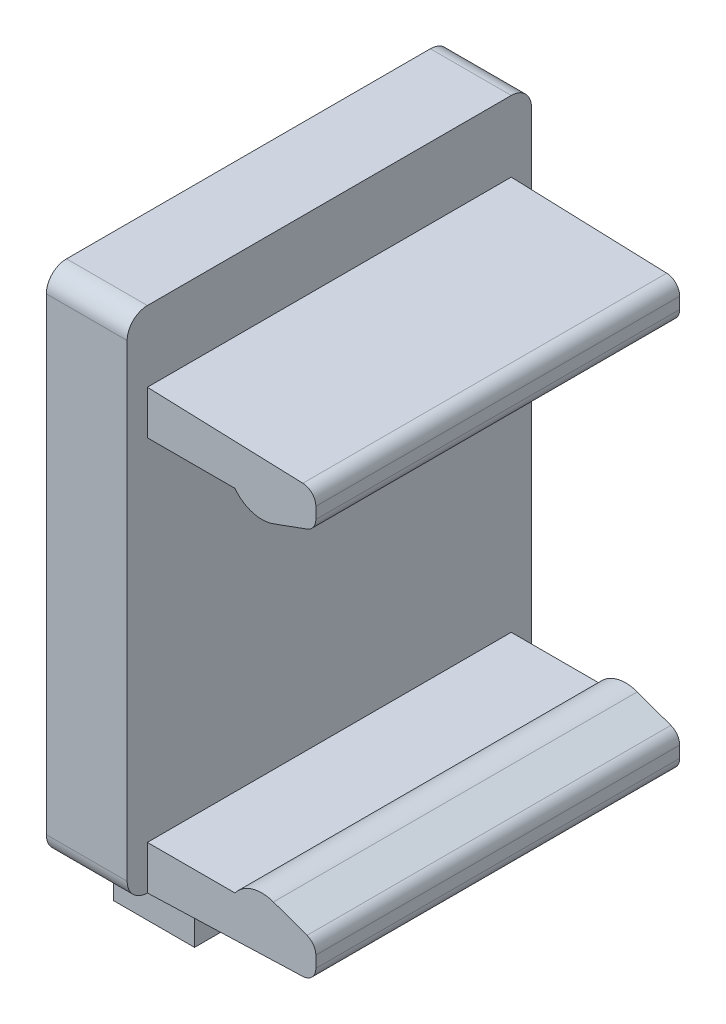
ISO-10303-21;
HEADER;
FILE_DESCRIPTION(('STEP AP214'),'2;1');
FILE_NAME('part.step','',(''),(''),'','','');
FILE_SCHEMA(('AUTOMOTIVE_DESIGN { 1 0 10303 214 1 1 1 1 }'));
ENDSEC;
DATA;
#1=APPLICATION_CONTEXT('core data for automotive mechanical design processes');
#2=APPLICATION_PROTOCOL_DEFINITION('international standard','automotive_design',2000,#1);
#3=PRODUCT_CONTEXT('',#1,'mechanical');
#4=PRODUCT('Part','Part','',(#3));
#5=PRODUCT_RELATED_PRODUCT_CATEGORY('part','',(#4));
#6=PRODUCT_DEFINITION_FORMATION('','',#4);
#7=PRODUCT_DEFINITION_CONTEXT('part definition',#1,'design');
#8=PRODUCT_DEFINITION('design','',#6,#7);
#9=PRODUCT_DEFINITION_SHAPE('','',#8);
#10=(LENGTH_UNIT() NAMED_UNIT(*) SI_UNIT(.MILLI.,.METRE.));
#11=(NAMED_UNIT(*) PLANE_ANGLE_UNIT() SI_UNIT($,.RADIAN.));
#12=(NAMED_UNIT(*) SI_UNIT($,.STERADIAN.) SOLID_ANGLE_UNIT());
#13=UNCERTAINTY_MEASURE_WITH_UNIT(LENGTH_MEASURE(1.E-05),#10,'distance_accuracy_value','');
#14=(GEOMETRIC_REPRESENTATION_CONTEXT(3) GLOBAL_UNCERTAINTY_ASSIGNED_CONTEXT((#13)) GLOBAL_UNIT_ASSIGNED_CONTEXT((#10,
#11,#12)) REPRESENTATION_CONTEXT('',''));
#15=CARTESIAN_POINT('',(0.,0.,0.));
#16=DIRECTION('',(0.,0.,1.));
#17=DIRECTION('',(1.,0.,0.));
#18=AXIS2_PLACEMENT_3D('',#15,#16,#17);
#19=CARTESIAN_POINT('',(-11.238795,-11.9225691911831,3.47573182009755));
#20=DIRECTION('',(0.,0.,-1.));
#21=DIRECTION('',(-1.,0.,0.));
#22=AXIS2_PLACEMENT_3D('',#19,#20,#21);
#23=CYLINDRICAL_SURFACE('',#22,0.2);
#24=DIRECTION('',(0.,0.,1.));
#25=VECTOR('',#24,1.);
#26=CARTESIAN_POINT('',(-11.1703909713349,-12.1105077153403,4.05));
#27=LINE('',#26,#25);
#28=CARTESIAN_POINT('',(-11.1703909713349,-12.1105077153403,0.0999999999999994));
#29=VERTEX_POINT('',#28);
#30=CARTESIAN_POINT('',(-11.1703909713349,-12.1105077153403,5.5));
#31=VERTEX_POINT('',#30);
#32=EDGE_CURVE('E301',#29,#31,#27,.T.);
#33=ORIENTED_EDGE('',*,*,#32,.F.);
#34=CARTESIAN_POINT('',(-11.238795,-11.9225691911831,0.0999999999999994));
#35=DIRECTION('',(0.,0.,-1.));
#36=DIRECTION('',(-1.,0.,0.));
#37=AXIS2_PLACEMENT_3D('',#34,#35,#36);
#38=CIRCLE('',#37,0.2);
#39=CARTESIAN_POINT('',(-11.038795,-11.9225691911831,0.0999999999999995));
#40=VERTEX_POINT('',#39);
#41=EDGE_CURVE('E193',#29,#40,#38,.F.);
#42=ORIENTED_EDGE('',*,*,#41,.T.);
#43=DIRECTION('',(0.,0.,-1.));
#44=VECTOR('',#43,1.);
#45=CARTESIAN_POINT('',(-11.038795,-11.9225691911831,4.8));
#46=LINE('',#45,#44);
#47=CARTESIAN_POINT('',(-11.038795,-11.9225691911831,5.5));
#48=VERTEX_POINT('',#47);
#49=EDGE_CURVE('E195',#48,#40,#46,.T.);
#50=ORIENTED_EDGE('',*,*,#49,.F.);
#51=CARTESIAN_POINT('',(-11.238795,-11.9225691911831,5.5));
#52=DIRECTION('',(0.,0.,-1.));
#53=DIRECTION('',(-1.,0.,0.));
#54=AXIS2_PLACEMENT_3D('',#51,#52,#53);
#55=CIRCLE('',#54,0.2);
#56=EDGE_CURVE('E19',#48,#31,#55,.T.);
#57=ORIENTED_EDGE('',*,*,#56,.T.);
#58=EDGE_LOOP('',(#33,#42,#50,#57));
#59=FACE_BOUND('',#58,.T.);
#60=ADVANCED_FACE('F16',(#59),#23,.T.);
#61=CARTESIAN_POINT('',(-11.238795,-17.520826808817,3.47573182009755));
#62=DIRECTION('',(0.,0.,1.));
#63=DIRECTION('',(1.,0.,0.));
#64=AXIS2_PLACEMENT_3D('',#61,#62,#63);
#65=CYLINDRICAL_SURFACE('',#64,0.2);
#66=DIRECTION('',(0.,0.,-1.));
#67=VECTOR('',#66,1.);
#68=CARTESIAN_POINT('',(-11.038795,-17.520826808817,4.8));
#69=LINE('',#68,#67);
#70=CARTESIAN_POINT('',(-11.038795,-17.520826808817,0.0999999999999995));
#71=VERTEX_POINT('',#70);
#72=CARTESIAN_POINT('',(-11.038795,-17.520826808817,5.5));
#73=VERTEX_POINT('',#72);
#74=EDGE_CURVE('E302',#71,#73,#69,.F.);
#75=ORIENTED_EDGE('',*,*,#74,.F.);
#76=CARTESIAN_POINT('',(-11.238795,-17.520826808817,0.0999999999999994));
#77=DIRECTION('',(0.,0.,1.));
#78=DIRECTION('',(1.,0.,0.));
#79=AXIS2_PLACEMENT_3D('',#76,#77,#78);
#80=CIRCLE('',#79,0.2);
#81=CARTESIAN_POINT('',(-11.1703909713349,-17.3328882846598,0.0999999999999992));
#82=VERTEX_POINT('',#81);
#83=EDGE_CURVE('E311',#71,#82,#80,.T.);
#84=ORIENTED_EDGE('',*,*,#83,.T.);
#85=DIRECTION('',(0.,0.,1.));
#86=VECTOR('',#85,1.);
#87=CARTESIAN_POINT('',(-11.1703909713349,-17.3328882846598,4.8));
#88=LINE('',#87,#86);
#89=CARTESIAN_POINT('',(-11.1703909713349,-17.3328882846598,5.5));
#90=VERTEX_POINT('',#89);
#91=EDGE_CURVE('E198',#90,#82,#88,.F.);
#92=ORIENTED_EDGE('',*,*,#91,.F.);
#93=CARTESIAN_POINT('',(-11.238795,-17.520826808817,5.5));
#94=DIRECTION('',(0.,0.,1.));
#95=DIRECTION('',(1.,0.,0.));
#96=AXIS2_PLACEMENT_3D('',#93,#94,#95);
#97=CIRCLE('',#96,0.2);
#98=EDGE_CURVE('E377',#90,#73,#97,.F.);
#99=ORIENTED_EDGE('',*,*,#98,.T.);
#100=EDGE_LOOP('',(#75,#84,#92,#99));
#101=FACE_BOUND('',#100,.T.);
#102=ADVANCED_FACE('F381',(#101),#65,.T.);
#103=CARTESIAN_POINT('',(-11.038795,-17.6949202530693,4.8));
#104=DIRECTION('',(1.,0.,0.));
#105=DIRECTION('',(0.,0.,-1.));
#106=AXIS2_PLACEMENT_3D('',#103,#104,#105);
#107=PLANE('',#106);
#108=ORIENTED_EDGE('',*,*,#74,.T.);
#109=DIRECTION('',(0.,1.,0.));
#110=VECTOR('',#109,1.);
#111=CARTESIAN_POINT('',(-11.038795,-17.825339417196,5.5));
#112=LINE('',#111,#110);
#113=CARTESIAN_POINT('',(-11.038795,-17.6912583213092,5.5));
#114=VERTEX_POINT('',#113);
#115=EDGE_CURVE('E249',#114,#73,#112,.T.);
#116=ORIENTED_EDGE('',*,*,#115,.F.);
#117=DIRECTION('',(0.,0.,1.));
#118=VECTOR('',#117,1.);
#119=CARTESIAN_POINT('',(-11.038795,-17.6912583213092,3.47573182009755));
#120=LINE('',#119,#118);
#121=CARTESIAN_POINT('',(-11.038795,-17.6912583213092,0.0999999999999995));
#122=VERTEX_POINT('',#121);
#123=EDGE_CURVE('E304',#122,#114,#120,.T.);
#124=ORIENTED_EDGE('',*,*,#123,.F.);
#125=DIRECTION('',(0.,1.,0.));
#126=VECTOR('',#125,1.);
#127=CARTESIAN_POINT('',(-11.038795,-18.721698,0.0999999999999996));
#128=LINE('',#127,#126);
#129=EDGE_CURVE('E274',#122,#71,#128,.T.);
#130=ORIENTED_EDGE('',*,*,#129,.T.);
#131=EDGE_LOOP('',(#108,#116,#124,#130));
#132=FACE_BOUND('',#131,.T.);
#133=ADVANCED_FACE('F385',(#132),#107,.T.);
#134=CARTESIAN_POINT('',(-11.6677849283372,-12.291544310393,4.05));
#135=DIRECTION('',(0.342020143325669,-0.939692620785908,0.));
#136=DIRECTION('',(0.939692620785908,0.342020143325669,0.));
#137=AXIS2_PLACEMENT_3D('',#134,#135,#136);
#138=PLANE('',#137);
#139=ORIENTED_EDGE('',*,*,#32,.T.);
#140=DIRECTION('',(0.939692620785908,0.342020143325669,0.));
#141=VECTOR('',#140,1.);
#142=CARTESIAN_POINT('',(-11.6677849283372,-12.291544310393,5.5));
#143=LINE('',#142,#141);
#144=CARTESIAN_POINT('',(-11.6677849283372,-12.291544310393,5.5));
#145=VERTEX_POINT('',#144);
#146=EDGE_CURVE('E189',#31,#145,#143,.F.);
#147=ORIENTED_EDGE('',*,*,#146,.T.);
#148=DIRECTION('',(0.,0.,1.));
#149=VECTOR('',#148,1.);
#150=CARTESIAN_POINT('',(-11.6677849283372,-12.291544310393,4.8));
#151=LINE('',#150,#149);
#152=CARTESIAN_POINT('',(-11.6677849283372,-12.291544310393,0.0999999999999994));
#153=VERTEX_POINT('',#152);
#154=EDGE_CURVE('E205',#153,#145,#151,.T.);
#155=ORIENTED_EDGE('',*,*,#154,.F.);
#156=DIRECTION('',(0.939692620785908,0.342020143325669,0.));
#157=VECTOR('',#156,1.);
#158=CARTESIAN_POINT('',(-11.6677849283372,-12.291544310393,0.0999999999999994));
#159=LINE('',#158,#157);
#160=EDGE_CURVE('E298',#153,#29,#159,.T.);
#161=ORIENTED_EDGE('',*,*,#160,.T.);
#162=EDGE_LOOP('',(#139,#147,#155,#161));
#163=FACE_BOUND('',#162,.T.);
#164=ADVANCED_FACE('F468',(#163),#138,.T.);
#165=CARTESIAN_POINT('',(-11.038795,-11.9181155020569,4.8));
#166=DIRECTION('',(1.,0.,0.));
#167=DIRECTION('',(0.,0.,-1.));
#168=AXIS2_PLACEMENT_3D('',#165,#166,#167);
#169=PLANE('',#168);
#170=DIRECTION('',(0.,0.,-1.));
#171=VECTOR('',#170,1.);
#172=CARTESIAN_POINT('',(-11.038795,-11.7521376786908,3.47573182009755));
#173=LINE('',#172,#171);
#174=CARTESIAN_POINT('',(-11.038795,-11.7521376786908,5.5));
#175=VERTEX_POINT('',#174);
#176=CARTESIAN_POINT('',(-11.038795,-11.7521376786908,0.0999999999999995));
#177=VERTEX_POINT('',#176);
#178=EDGE_CURVE('E202',#175,#177,#173,.T.);
#179=ORIENTED_EDGE('',*,*,#178,.F.);
#180=DIRECTION('',(0.,1.,0.));
#181=VECTOR('',#180,1.);
#182=CARTESIAN_POINT('',(-11.038795,-17.825339417196,5.5));
#183=LINE('',#182,#181);
#184=EDGE_CURVE('E186',#48,#175,#183,.T.);
#185=ORIENTED_EDGE('',*,*,#184,.F.);
#186=ORIENTED_EDGE('',*,*,#49,.T.);
#187=DIRECTION('',(0.,1.,0.));
#188=VECTOR('',#187,1.);
#189=CARTESIAN_POINT('',(-11.038795,-18.721698,0.0999999999999996));
#190=LINE('',#189,#188);
#191=EDGE_CURVE('E371',#40,#177,#190,.T.);
#192=ORIENTED_EDGE('',*,*,#191,.T.);
#193=EDGE_LOOP('',(#179,#185,#186,#192));
#194=FACE_BOUND('',#193,.T.);
#195=ADVANCED_FACE('F200',(#194),#169,.T.);
#196=CARTESIAN_POINT('',(-11.1581545610274,-17.337341973786,4.8));
#197=DIRECTION('',(0.342020143325669,0.939692620785908,0.));
#198=DIRECTION('',(-0.939692620785908,0.342020143325669,0.));
#199=AXIS2_PLACEMENT_3D('',#196,#197,#198);
#200=PLANE('',#199);
#201=DIRECTION('',(0.,0.,-1.));
#202=VECTOR('',#201,1.);
#203=CARTESIAN_POINT('',(-11.6677849283372,-17.151851689607,4.8));
#204=LINE('',#203,#202);
#205=CARTESIAN_POINT('',(-11.6677849283372,-17.151851689607,5.5));
#206=VERTEX_POINT('',#205);
#207=CARTESIAN_POINT('',(-11.6677849283371,-17.151851689607,0.0999999999999994));
#208=VERTEX_POINT('',#207);
#209=EDGE_CURVE('E286',#206,#208,#204,.T.);
#210=ORIENTED_EDGE('',*,*,#209,.F.);
#211=DIRECTION('',(-0.93969262078586,0.342020143325803,0.));
#212=VECTOR('',#211,1.);
#213=CARTESIAN_POINT('',(-11.1703909713349,-17.3328882846598,5.5));
#214=LINE('',#213,#212);
#215=EDGE_CURVE('E246',#90,#206,#214,.T.);
#216=ORIENTED_EDGE('',*,*,#215,.F.);
#217=ORIENTED_EDGE('',*,*,#91,.T.);
#218=DIRECTION('',(-0.939692620785859,0.342020143325804,0.));
#219=VECTOR('',#218,1.);
#220=CARTESIAN_POINT('',(-11.1703909713349,-17.3328882846598,0.0999999999999996));
#221=LINE('',#220,#219);
#222=EDGE_CURVE('E256',#82,#208,#221,.T.);
#223=ORIENTED_EDGE('',*,*,#222,.T.);
#224=EDGE_LOOP('',(#210,#216,#217,#223));
#225=FACE_BOUND('',#224,.T.);
#226=ADVANCED_FACE('F402',(#225),#200,.T.);
#227=CARTESIAN_POINT('',(1.3412026,-18.721698,0.0999999999999996));
#228=DIRECTION('',(0.,0.,1.));
#229=DIRECTION('',(1.,0.,0.));
#230=AXIS2_PLACEMENT_3D('',#227,#228,#229);
#231=PLANE('',#230);
#232=ORIENTED_EDGE('',*,*,#222,.F.);
#233=ORIENTED_EDGE('',*,*,#83,.F.);
#234=ORIENTED_EDGE('',*,*,#129,.F.);
#235=CARTESIAN_POINT('',(-11.238795,-17.6912583213092,0.0999999999999994));
#236=DIRECTION('',(0.,0.,1.));
#237=DIRECTION('',(1.,0.,0.));
#238=AXIS2_PLACEMENT_3D('',#235,#236,#237);
#239=CIRCLE('',#238,0.2);
#240=CARTESIAN_POINT('',(-11.2318151006595,-17.891136486713,0.0999999999999995));
#241=VERTEX_POINT('',#240);
#242=EDGE_CURVE('E248',#241,#122,#239,.T.);
#243=ORIENTED_EDGE('',*,*,#242,.F.);
#244=DIRECTION('',(-0.999390827019096,-0.034899496702501,0.));
#245=VECTOR('',#244,1.);
#246=CARTESIAN_POINT('',(-13.538795,-17.971698,0.0999999999999996));
#247=LINE('',#246,#245);
#248=CARTESIAN_POINT('',(-13.538795,-17.971698,0.0999999999999996));
#249=VERTEX_POINT('',#248);
#250=EDGE_CURVE('E268',#241,#249,#247,.T.);
#251=ORIENTED_EDGE('',*,*,#250,.T.);
#252=DIRECTION('',(0.,1.,0.));
#253=VECTOR('',#252,1.);
#254=CARTESIAN_POINT('',(-13.538795,-18.721698,0.0999999999999996));
#255=LINE('',#254,#253);
#256=CARTESIAN_POINT('',(-13.538795,-17.321698,0.0999999999999995));
#257=VERTEX_POINT('',#256);
#258=EDGE_CURVE('E277',#257,#249,#255,.F.);
#259=ORIENTED_EDGE('',*,*,#258,.F.);
#260=DIRECTION('',(1.,0.,0.));
#261=VECTOR('',#260,1.);
#262=CARTESIAN_POINT('',(1.3412026,-17.321698,0.0999999999999996));
#263=LINE('',#262,#261);
#264=CARTESIAN_POINT('',(-12.238795,-17.321698,0.0999999999999995));
#265=VERTEX_POINT('',#264);
#266=EDGE_CURVE('E278',#265,#257,#263,.F.);
#267=ORIENTED_EDGE('',*,*,#266,.F.);
#268=CARTESIAN_POINT('',(-11.838795,-17.621698,0.0999999999999994));
#269=DIRECTION('',(0.,0.,-1.));
#270=DIRECTION('',(-1.,0.,0.));
#271=AXIS2_PLACEMENT_3D('',#268,#269,#270);
#272=CIRCLE('',#271,0.5);
#273=EDGE_CURVE('E272',#208,#265,#272,.F.);
#274=ORIENTED_EDGE('',*,*,#273,.F.);
#275=EDGE_LOOP('',(#232,#233,#234,#243,#251,#259,#267,#274));
#276=FACE_BOUND('',#275,.T.);
#277=ADVANCED_FACE('F396',(#276),#231,.F.);
#278=CARTESIAN_POINT('',(1.93750009229007,-17.825339417196,5.5));
#279=DIRECTION('',(0.,0.,1.));
#280=DIRECTION('',(1.,0.,0.));
#281=AXIS2_PLACEMENT_3D('',#278,#279,#280);
#282=PLANE('',#281);
#283=ORIENTED_EDGE('',*,*,#215,.T.);
#284=CARTESIAN_POINT('',(-11.838795,-17.621698,5.5));
#285=DIRECTION('',(0.,0.,-1.));
#286=DIRECTION('',(-1.,0.,0.));
#287=AXIS2_PLACEMENT_3D('',#284,#285,#286);
#288=CIRCLE('',#287,0.5);
#289=CARTESIAN_POINT('',(-12.238795,-17.321698,5.5));
#290=VERTEX_POINT('',#289);
#291=EDGE_CURVE('E289',#290,#206,#288,.T.);
#292=ORIENTED_EDGE('',*,*,#291,.F.);
#293=DIRECTION('',(1.,0.,0.));
#294=VECTOR('',#293,1.);
#295=CARTESIAN_POINT('',(1.93750009229007,-17.321698,5.5));
#296=LINE('',#295,#294);
#297=CARTESIAN_POINT('',(-13.538795,-17.321698,5.5));
#298=VERTEX_POINT('',#297);
#299=EDGE_CURVE('E253',#290,#298,#296,.F.);
#300=ORIENTED_EDGE('',*,*,#299,.T.);
#301=DIRECTION('',(0.,1.,0.));
#302=VECTOR('',#301,1.);
#303=CARTESIAN_POINT('',(-13.538795,-17.825339417196,5.5));
#304=LINE('',#303,#302);
#305=CARTESIAN_POINT('',(-13.538795,-17.971698,5.5));
#306=VERTEX_POINT('',#305);
#307=EDGE_CURVE('E252',#298,#306,#304,.F.);
#308=ORIENTED_EDGE('',*,*,#307,.T.);
#309=DIRECTION('',(-0.999390827019096,-0.034899496702501,0.));
#310=VECTOR('',#309,1.);
#311=CARTESIAN_POINT('',(-13.538795,-17.971698,5.5));
#312=LINE('',#311,#310);
#313=CARTESIAN_POINT('',(-11.2318151006595,-17.891136486713,5.5));
#314=VERTEX_POINT('',#313);
#315=EDGE_CURVE('E259',#306,#314,#312,.F.);
#316=ORIENTED_EDGE('',*,*,#315,.T.);
#317=CARTESIAN_POINT('',(-11.238795,-17.6912583213092,5.5));
#318=DIRECTION('',(0.,0.,1.));
#319=DIRECTION('',(1.,0.,0.));
#320=AXIS2_PLACEMENT_3D('',#317,#318,#319);
#321=CIRCLE('',#320,0.2);
#322=EDGE_CURVE('E211',#114,#314,#321,.F.);
#323=ORIENTED_EDGE('',*,*,#322,.F.);
#324=ORIENTED_EDGE('',*,*,#115,.T.);
#325=ORIENTED_EDGE('',*,*,#98,.F.);
#326=EDGE_LOOP('',(#283,#292,#300,#308,#316,#323,#324,#325));
#327=FACE_BOUND('',#326,.T.);
#328=ADVANCED_FACE('F388',(#327),#282,.T.);
#329=CARTESIAN_POINT('',(-11.238795,-17.6912583213092,3.47573182009755));
#330=DIRECTION('',(0.,0.,1.));
#331=DIRECTION('',(1.,0.,0.));
#332=AXIS2_PLACEMENT_3D('',#329,#330,#331);
#333=CYLINDRICAL_SURFACE('',#332,0.2);
#334=ORIENTED_EDGE('',*,*,#123,.T.);
#335=ORIENTED_EDGE('',*,*,#322,.T.);
#336=DIRECTION('',(0.,0.,1.));
#337=VECTOR('',#336,1.);
#338=CARTESIAN_POINT('',(-11.2318151006595,-17.891136486713,-0.8000024));
#339=LINE('',#338,#337);
#340=EDGE_CURVE('E230',#314,#241,#339,.F.);
#341=ORIENTED_EDGE('',*,*,#340,.T.);
#342=ORIENTED_EDGE('',*,*,#242,.T.);
#343=EDGE_LOOP('',(#334,#335,#341,#342));
#344=FACE_BOUND('',#343,.T.);
#345=ADVANCED_FACE('F392',(#344),#333,.T.);
#346=CARTESIAN_POINT('',(-11.838795,-11.821698,4.8));
#347=DIRECTION('',(0.,0.,1.));
#348=DIRECTION('',(1.,0.,0.));
#349=AXIS2_PLACEMENT_3D('',#346,#347,#348);
#350=CYLINDRICAL_SURFACE('',#349,0.5);
#351=ORIENTED_EDGE('',*,*,#154,.T.);
#352=CARTESIAN_POINT('',(-11.838795,-11.821698,5.5));
#353=DIRECTION('',(0.,0.,1.));
#354=DIRECTION('',(1.,0.,0.));
#355=AXIS2_PLACEMENT_3D('',#352,#353,#354);
#356=CIRCLE('',#355,0.5);
#357=CARTESIAN_POINT('',(-12.238795,-12.121698,5.5));
#358=VERTEX_POINT('',#357);
#359=EDGE_CURVE('E208',#358,#145,#356,.T.);
#360=ORIENTED_EDGE('',*,*,#359,.F.);
#361=DIRECTION('',(0.,0.,1.));
#362=VECTOR('',#361,1.);
#363=CARTESIAN_POINT('',(-12.238795,-12.121698,1.55));
#364=LINE('',#363,#362);
#365=CARTESIAN_POINT('',(-12.238795,-12.121698,0.0999999999999995));
#366=VERTEX_POINT('',#365);
#367=EDGE_CURVE('E226',#366,#358,#364,.T.);
#368=ORIENTED_EDGE('',*,*,#367,.F.);
#369=CARTESIAN_POINT('',(-11.838795,-11.821698,0.0999999999999994));
#370=DIRECTION('',(0.,0.,1.));
#371=DIRECTION('',(1.,0.,0.));
#372=AXIS2_PLACEMENT_3D('',#369,#370,#371);
#373=CIRCLE('',#372,0.5);
#374=EDGE_CURVE('E366',#366,#153,#373,.T.);
#375=ORIENTED_EDGE('',*,*,#374,.T.);
#376=EDGE_LOOP('',(#351,#360,#368,#375));
#377=FACE_BOUND('',#376,.T.);
#378=ADVANCED_FACE('F464',(#377),#350,.T.);
#379=CARTESIAN_POINT('',(1.93750009229007,-17.825339417196,5.5));
#380=DIRECTION('',(0.,0.,1.));
#381=DIRECTION('',(1.,0.,0.));
#382=AXIS2_PLACEMENT_3D('',#379,#380,#381);
#383=PLANE('',#382);
#384=DIRECTION('',(1.,0.,0.));
#385=VECTOR('',#384,1.);
#386=CARTESIAN_POINT('',(-12.838795,-12.121698,5.5));
#387=LINE('',#386,#385);
#388=CARTESIAN_POINT('',(-13.538795,-12.121698,5.5));
#389=VERTEX_POINT('',#388);
#390=EDGE_CURVE('E229',#358,#389,#387,.F.);
#391=ORIENTED_EDGE('',*,*,#390,.F.);
#392=ORIENTED_EDGE('',*,*,#359,.T.);
#393=ORIENTED_EDGE('',*,*,#146,.F.);
#394=ORIENTED_EDGE('',*,*,#56,.F.);
#395=ORIENTED_EDGE('',*,*,#184,.T.);
#396=CARTESIAN_POINT('',(-11.238795,-11.7521376786908,5.5));
#397=DIRECTION('',(0.,0.,-1.));
#398=DIRECTION('',(-1.,0.,0.));
#399=AXIS2_PLACEMENT_3D('',#396,#397,#398);
#400=CIRCLE('',#399,0.2);
#401=CARTESIAN_POINT('',(-11.2318151006595,-11.552259513287,5.5));
#402=VERTEX_POINT('',#401);
#403=EDGE_CURVE('E296',#402,#175,#400,.T.);
#404=ORIENTED_EDGE('',*,*,#403,.F.);
#405=DIRECTION('',(0.999390827019096,-0.034899496702501,0.));
#406=VECTOR('',#405,1.);
#407=CARTESIAN_POINT('',(-10.539261,-11.5764440353967,5.5));
#408=LINE('',#407,#406);
#409=CARTESIAN_POINT('',(-13.538795,-11.471698,5.5));
#410=VERTEX_POINT('',#409);
#411=EDGE_CURVE('E217',#402,#410,#408,.F.);
#412=ORIENTED_EDGE('',*,*,#411,.T.);
#413=DIRECTION('',(0.,1.,0.));
#414=VECTOR('',#413,1.);
#415=CARTESIAN_POINT('',(-13.538795,-17.825339417196,5.5));
#416=LINE('',#415,#414);
#417=EDGE_CURVE('E204',#410,#389,#416,.F.);
#418=ORIENTED_EDGE('',*,*,#417,.T.);
#419=EDGE_LOOP('',(#391,#392,#393,#394,#395,#404,#412,#418));
#420=FACE_BOUND('',#419,.T.);
#421=ADVANCED_FACE('F184',(#420),#383,.T.);
#422=CARTESIAN_POINT('',(1.3412026,-18.721698,0.0999999999999996));
#423=DIRECTION('',(0.,0.,1.));
#424=DIRECTION('',(1.,0.,0.));
#425=AXIS2_PLACEMENT_3D('',#422,#423,#424);
#426=PLANE('',#425);
#427=ORIENTED_EDGE('',*,*,#374,.F.);
#428=DIRECTION('',(1.,0.,0.));
#429=VECTOR('',#428,1.);
#430=CARTESIAN_POINT('',(-12.838795,-12.121698,0.0999999999999996));
#431=LINE('',#430,#429);
#432=CARTESIAN_POINT('',(-13.538795,-12.121698,0.0999999999999995));
#433=VERTEX_POINT('',#432);
#434=EDGE_CURVE('E221',#433,#366,#431,.T.);
#435=ORIENTED_EDGE('',*,*,#434,.F.);
#436=DIRECTION('',(0.,1.,0.));
#437=VECTOR('',#436,1.);
#438=CARTESIAN_POINT('',(-13.538795,-18.721698,0.0999999999999996));
#439=LINE('',#438,#437);
#440=CARTESIAN_POINT('',(-13.538795,-11.471698,0.0999999999999995));
#441=VERTEX_POINT('',#440);
#442=EDGE_CURVE('E369',#441,#433,#439,.F.);
#443=ORIENTED_EDGE('',*,*,#442,.F.);
#444=DIRECTION('',(0.999390827019096,-0.034899496702501,0.));
#445=VECTOR('',#444,1.);
#446=CARTESIAN_POINT('',(-10.539261,-11.5764440353967,0.0999999999999996));
#447=LINE('',#446,#445);
#448=CARTESIAN_POINT('',(-11.2318151006595,-11.552259513287,0.0999999999999995));
#449=VERTEX_POINT('',#448);
#450=EDGE_CURVE('E220',#441,#449,#447,.T.);
#451=ORIENTED_EDGE('',*,*,#450,.T.);
#452=CARTESIAN_POINT('',(-11.238795,-11.7521376786908,0.0999999999999994));
#453=DIRECTION('',(0.,0.,-1.));
#454=DIRECTION('',(-1.,0.,0.));
#455=AXIS2_PLACEMENT_3D('',#452,#453,#454);
#456=CIRCLE('',#455,0.2);
#457=EDGE_CURVE('E295',#177,#449,#456,.F.);
#458=ORIENTED_EDGE('',*,*,#457,.F.);
#459=ORIENTED_EDGE('',*,*,#191,.F.);
#460=ORIENTED_EDGE('',*,*,#41,.F.);
#461=ORIENTED_EDGE('',*,*,#160,.F.);
#462=EDGE_LOOP('',(#427,#435,#443,#451,#458,#459,#460,#461));
#463=FACE_BOUND('',#462,.T.);
#464=ADVANCED_FACE('F465',(#463),#426,.F.);
#465=CARTESIAN_POINT('',(-11.238795,-11.7521376786908,3.47573182009755));
#466=DIRECTION('',(0.,0.,-1.));
#467=DIRECTION('',(-1.,0.,0.));
#468=AXIS2_PLACEMENT_3D('',#465,#466,#467);
#469=CYLINDRICAL_SURFACE('',#468,0.2);
#470=ORIENTED_EDGE('',*,*,#178,.T.);
#471=ORIENTED_EDGE('',*,*,#457,.T.);
#472=DIRECTION('',(0.,0.,1.));
#473=VECTOR('',#472,1.);
#474=CARTESIAN_POINT('',(-11.2318151006595,-11.552259513287,-0.8000024));
#475=LINE('',#474,#473);
#476=EDGE_CURVE('E294',#449,#402,#475,.T.);
#477=ORIENTED_EDGE('',*,*,#476,.T.);
#478=ORIENTED_EDGE('',*,*,#403,.T.);
#479=EDGE_LOOP('',(#470,#471,#477,#478));
#480=FACE_BOUND('',#479,.T.);
#481=ADVANCED_FACE('F557',(#480),#469,.T.);
#482=CARTESIAN_POINT('',(-11.838795,-17.621698,4.8));
#483=DIRECTION('',(0.,0.,-1.));
#484=DIRECTION('',(-1.,0.,0.));
#485=AXIS2_PLACEMENT_3D('',#482,#483,#484);
#486=CYLINDRICAL_SURFACE('',#485,0.5);
#487=ORIENTED_EDGE('',*,*,#209,.T.);
#488=ORIENTED_EDGE('',*,*,#273,.T.);
#489=DIRECTION('',(0.,0.,1.));
#490=VECTOR('',#489,1.);
#491=CARTESIAN_POINT('',(-12.238795,-17.321698,1.55));
#492=LINE('',#491,#490);
#493=EDGE_CURVE('E290',#290,#265,#492,.F.);
#494=ORIENTED_EDGE('',*,*,#493,.F.);
#495=ORIENTED_EDGE('',*,*,#291,.T.);
#496=EDGE_LOOP('',(#487,#488,#494,#495));
#497=FACE_BOUND('',#496,.T.);
#498=ADVANCED_FACE('F406',(#497),#486,.T.);
#499=CARTESIAN_POINT('',(-13.538795,-17.971698,-0.8000024));
#500=DIRECTION('',(-0.034899496702501,0.999390827019096,0.));
#501=DIRECTION('',(-0.999390827019096,-0.034899496702501,0.));
#502=AXIS2_PLACEMENT_3D('',#499,#500,#501);
#503=PLANE('',#502);
#504=ORIENTED_EDGE('',*,*,#315,.F.);
#505=DIRECTION('',(0.,0.,1.));
#506=VECTOR('',#505,1.);
#507=CARTESIAN_POINT('',(-13.538795,-17.971698,-0.8000024));
#508=LINE('',#507,#506);
#509=CARTESIAN_POINT('',(-13.538795,-17.971698,5.1));
#510=VERTEX_POINT('',#509);
#511=EDGE_CURVE('E261',#510,#306,#508,.T.);
#512=ORIENTED_EDGE('',*,*,#511,.F.);
#513=DIRECTION('',(0.,0.,1.));
#514=VECTOR('',#513,1.);
#515=CARTESIAN_POINT('',(-13.538795,-17.971698,3.47573182009755));
#516=LINE('',#515,#514);
#517=CARTESIAN_POINT('',(-13.538795,-17.971698,0.5));
#518=VERTEX_POINT('',#517);
#519=EDGE_CURVE('E239',#510,#518,#516,.F.);
#520=ORIENTED_EDGE('',*,*,#519,.T.);
#521=DIRECTION('',(0.,0.,1.));
#522=VECTOR('',#521,1.);
#523=CARTESIAN_POINT('',(-13.538795,-17.971698,-0.8000024));
#524=LINE('',#523,#522);
#525=EDGE_CURVE('E271',#249,#518,#524,.T.);
#526=ORIENTED_EDGE('',*,*,#525,.F.);
#527=ORIENTED_EDGE('',*,*,#250,.F.);
#528=ORIENTED_EDGE('',*,*,#340,.F.);
#529=EDGE_LOOP('',(#504,#512,#520,#526,#527,#528));
#530=FACE_BOUND('',#529,.T.);
#531=ADVANCED_FACE('F419',(#530),#503,.F.);
#532=CARTESIAN_POINT('',(-12.838795,-12.121698,1.55));
#533=DIRECTION('',(0.,-1.,0.));
#534=DIRECTION('',(1.,0.,0.));
#535=AXIS2_PLACEMENT_3D('',#532,#533,#534);
#536=PLANE('',#535);
#537=DIRECTION('',(0.,0.,1.));
#538=VECTOR('',#537,1.);
#539=CARTESIAN_POINT('',(-13.538795,-12.121698,3.47573182009755));
#540=LINE('',#539,#538);
#541=EDGE_CURVE('E235',#389,#433,#540,.F.);
#542=ORIENTED_EDGE('',*,*,#541,.T.);
#543=ORIENTED_EDGE('',*,*,#434,.T.);
#544=ORIENTED_EDGE('',*,*,#367,.T.);
#545=ORIENTED_EDGE('',*,*,#390,.T.);
#546=EDGE_LOOP('',(#542,#543,#544,#545));
#547=FACE_BOUND('',#546,.T.);
#548=ADVANCED_FACE('F461',(#547),#536,.T.);
#549=CARTESIAN_POINT('',(-10.539261,-11.5764440353967,-0.8000024));
#550=DIRECTION('',(-0.034899496702501,-0.999390827019096,0.));
#551=DIRECTION('',(0.999390827019096,-0.034899496702501,0.));
#552=AXIS2_PLACEMENT_3D('',#549,#550,#551);
#553=PLANE('',#552);
#554=ORIENTED_EDGE('',*,*,#450,.F.);
#555=DIRECTION('',(0.,0.,1.));
#556=VECTOR('',#555,1.);
#557=CARTESIAN_POINT('',(-13.538795,-11.471698,3.47573182009755));
#558=LINE('',#557,#556);
#559=EDGE_CURVE('E238',#441,#410,#558,.T.);
#560=ORIENTED_EDGE('',*,*,#559,.T.);
#561=ORIENTED_EDGE('',*,*,#411,.F.);
#562=ORIENTED_EDGE('',*,*,#476,.F.);
#563=EDGE_LOOP('',(#554,#560,#561,#562));
#564=FACE_BOUND('',#563,.T.);
#565=ADVANCED_FACE('F442',(#564),#553,.F.);
#566=CARTESIAN_POINT('',(-12.238795,-17.321698,1.55));
#567=DIRECTION('',(0.,1.,0.));
#568=DIRECTION('',(-1.,0.,0.));
#569=AXIS2_PLACEMENT_3D('',#566,#567,#568);
#570=PLANE('',#569);
#571=ORIENTED_EDGE('',*,*,#493,.T.);
#572=ORIENTED_EDGE('',*,*,#266,.T.);
#573=DIRECTION('',(0.,0.,1.));
#574=VECTOR('',#573,1.);
#575=CARTESIAN_POINT('',(-13.538795,-17.321698,3.47573182009755));
#576=LINE('',#575,#574);
#577=EDGE_CURVE('E312',#257,#298,#576,.T.);
#578=ORIENTED_EDGE('',*,*,#577,.T.);
#579=ORIENTED_EDGE('',*,*,#299,.F.);
#580=EDGE_LOOP('',(#571,#572,#578,#579));
#581=FACE_BOUND('',#580,.T.);
#582=ADVANCED_FACE('F408',(#581),#570,.T.);
#583=CARTESIAN_POINT('',(-13.538795,-12.8336952519218,3.47573182009755));
#584=DIRECTION('',(-1.,0.,0.));
#585=DIRECTION('',(0.,0.,1.));
#586=AXIS2_PLACEMENT_3D('',#583,#584,#585);
#587=PLANE('',#586);
#588=CARTESIAN_POINT('',(-13.538795,-18.271698,5.1));
#589=DIRECTION('',(-1.,0.,0.));
#590=DIRECTION('',(0.,0.,1.));
#591=AXIS2_PLACEMENT_3D('',#588,#589,#590);
#592=CIRCLE('',#591,0.3);
#593=CARTESIAN_POINT('',(-13.538795,-18.271698,4.8));
#594=VERTEX_POINT('',#593);
#595=EDGE_CURVE('E355',#594,#510,#592,.F.);
#596=ORIENTED_EDGE('',*,*,#595,.F.);
#597=DIRECTION('',(0.,1.,0.));
#598=VECTOR('',#597,1.);
#599=CARTESIAN_POINT('',(-13.538795,-12.8336952519218,4.8));
#600=LINE('',#599,#598);
#601=CARTESIAN_POINT('',(-13.538795,-19.021698,4.8));
#602=VERTEX_POINT('',#601);
#603=EDGE_CURVE('E357',#602,#594,#600,.T.);
#604=ORIENTED_EDGE('',*,*,#603,.F.);
#605=DIRECTION('',(0.,0.,-1.));
#606=VECTOR('',#605,1.);
#607=CARTESIAN_POINT('',(-13.538795,-19.021698,1.8));
#608=LINE('',#607,#606);
#609=CARTESIAN_POINT('',(-13.538795,-19.021698,0.8));
#610=VERTEX_POINT('',#609);
#611=EDGE_CURVE('E810',#610,#602,#608,.F.);
#612=ORIENTED_EDGE('',*,*,#611,.F.);
#613=DIRECTION('',(0.,1.,0.));
#614=VECTOR('',#613,1.);
#615=CARTESIAN_POINT('',(-13.538795,-17.825339417196,0.8));
#616=LINE('',#615,#614);
#617=CARTESIAN_POINT('',(-13.538795,-18.271698,0.8));
#618=VERTEX_POINT('',#617);
#619=EDGE_CURVE('E315',#618,#610,#616,.F.);
#620=ORIENTED_EDGE('',*,*,#619,.F.);
#621=CARTESIAN_POINT('',(-13.538795,-18.271698,0.5));
#622=DIRECTION('',(1.,0.,0.));
#623=DIRECTION('',(0.,0.,-1.));
#624=AXIS2_PLACEMENT_3D('',#621,#622,#623);
#625=CIRCLE('',#624,0.3);
#626=EDGE_CURVE('E293',#518,#618,#625,.T.);
#627=ORIENTED_EDGE('',*,*,#626,.F.);
#628=ORIENTED_EDGE('',*,*,#519,.F.);
#629=EDGE_LOOP('',(#596,#604,#612,#620,#627,#628));
#630=FACE_BOUND('',#629,.T.);
#631=ADVANCED_FACE('F543',(#630),#587,.F.);
#632=CARTESIAN_POINT('',(-13.538795,-12.8336952519218,3.47573182009755));
#633=DIRECTION('',(-1.,0.,0.));
#634=DIRECTION('',(0.,0.,1.));
#635=AXIS2_PLACEMENT_3D('',#632,#633,#634);
#636=PLANE('',#635);
#637=CARTESIAN_POINT('',(-13.538795,-10.721698,0.0999999999999996));
#638=DIRECTION('',(1.,0.,0.));
#639=DIRECTION('',(0.,0.,-1.));
#640=AXIS2_PLACEMENT_3D('',#637,#638,#639);
#641=CIRCLE('',#640,0.3);
#642=CARTESIAN_POINT('',(-13.538795,-10.421698,0.0999999999999996));
#643=VERTEX_POINT('',#642);
#644=CARTESIAN_POINT('',(-13.538795,-10.721698,-0.2));
#645=VERTEX_POINT('',#644);
#646=EDGE_CURVE('E340',#643,#645,#641,.F.);
#647=ORIENTED_EDGE('',*,*,#646,.F.);
#648=DIRECTION('',(0.,0.,1.));
#649=VECTOR('',#648,1.);
#650=CARTESIAN_POINT('',(-13.538795,-10.421698,6.3));
#651=LINE('',#650,#649);
#652=CARTESIAN_POINT('',(-13.538795,-10.421698,5.5));
#653=VERTEX_POINT('',#652);
#654=EDGE_CURVE('E830',#653,#643,#651,.F.);
#655=ORIENTED_EDGE('',*,*,#654,.F.);
#656=CARTESIAN_POINT('',(-13.538795,-10.721698,5.5));
#657=DIRECTION('',(-1.,0.,0.));
#658=DIRECTION('',(0.,0.,1.));
#659=AXIS2_PLACEMENT_3D('',#656,#657,#658);
#660=CIRCLE('',#659,0.3);
#661=CARTESIAN_POINT('',(-13.538795,-10.721698,5.8));
#662=VERTEX_POINT('',#661);
#663=EDGE_CURVE('E345',#662,#653,#660,.T.);
#664=ORIENTED_EDGE('',*,*,#663,.F.);
#665=DIRECTION('',(0.,1.,0.));
#666=VECTOR('',#665,1.);
#667=CARTESIAN_POINT('',(-13.538795,-10.721698,5.8));
#668=LINE('',#667,#666);
#669=CARTESIAN_POINT('',(-13.538795,-17.671698,5.8));
#670=VERTEX_POINT('',#669);
#671=EDGE_CURVE('E832',#670,#662,#668,.T.);
#672=ORIENTED_EDGE('',*,*,#671,.F.);
#673=CARTESIAN_POINT('',(-13.538795,-17.671698,5.5));
#674=DIRECTION('',(1.,0.,0.));
#675=DIRECTION('',(0.,0.,-1.));
#676=AXIS2_PLACEMENT_3D('',#673,#674,#675);
#677=CIRCLE('',#676,0.3);
#678=EDGE_CURVE('E349',#306,#670,#677,.F.);
#679=ORIENTED_EDGE('',*,*,#678,.F.);
#680=ORIENTED_EDGE('',*,*,#307,.F.);
#681=ORIENTED_EDGE('',*,*,#577,.F.);
#682=ORIENTED_EDGE('',*,*,#258,.T.);
#683=CARTESIAN_POINT('',(-13.538795,-17.671698,0.0999999999999996));
#684=DIRECTION('',(1.,0.,0.));
#685=DIRECTION('',(0.,0.,-1.));
#686=AXIS2_PLACEMENT_3D('',#683,#684,#685);
#687=CIRCLE('',#686,0.3);
#688=CARTESIAN_POINT('',(-13.538795,-17.671698,-0.2));
#689=VERTEX_POINT('',#688);
#690=EDGE_CURVE('E316',#689,#249,#687,.F.);
#691=ORIENTED_EDGE('',*,*,#690,.F.);
#692=DIRECTION('',(0.,1.,0.));
#693=VECTOR('',#692,1.);
#694=CARTESIAN_POINT('',(-13.538795,-18.721698,-0.2));
#695=LINE('',#694,#693);
#696=EDGE_CURVE('E343',#645,#689,#695,.F.);
#697=ORIENTED_EDGE('',*,*,#696,.F.);
#698=EDGE_LOOP('',(#647,#655,#664,#672,#679,#680,#681,#682,#691,#697));
#699=FACE_BOUND('',#698,.T.);
#700=ORIENTED_EDGE('',*,*,#442,.T.);
#701=ORIENTED_EDGE('',*,*,#541,.F.);
#702=ORIENTED_EDGE('',*,*,#417,.F.);
#703=ORIENTED_EDGE('',*,*,#559,.F.);
#704=EDGE_LOOP('',(#700,#701,#702,#703));
#705=FACE_BOUND('',#704,.T.);
#706=ADVANCED_FACE('F413',(#699,#705),#636,.F.);
#707=CARTESIAN_POINT('',(-14.0150900922901,-17.825339417196,0.8));
#708=DIRECTION('',(0.,0.,-1.));
#709=DIRECTION('',(-1.,0.,0.));
#710=AXIS2_PLACEMENT_3D('',#707,#708,#709);
#711=PLANE('',#710);
#712=DIRECTION('',(1.,0.,0.));
#713=VECTOR('',#712,1.);
#714=CARTESIAN_POINT('',(1.461205,-19.021698,0.8));
#715=LINE('',#714,#713);
#716=CARTESIAN_POINT('',(-14.738795,-19.021698,0.8));
#717=VERTEX_POINT('',#716);
#718=EDGE_CURVE('E819',#717,#610,#715,.T.);
#719=ORIENTED_EDGE('',*,*,#718,.F.);
#720=DIRECTION('',(0.,1.,0.));
#721=VECTOR('',#720,1.);
#722=CARTESIAN_POINT('',(-14.738795,-12.8336952519218,0.8));
#723=LINE('',#722,#721);
#724=CARTESIAN_POINT('',(-14.738795,-18.271698,0.8));
#725=VERTEX_POINT('',#724);
#726=EDGE_CURVE('E816',#725,#717,#723,.F.);
#727=ORIENTED_EDGE('',*,*,#726,.F.);
#728=DIRECTION('',(1.,0.,0.));
#729=VECTOR('',#728,1.);
#730=CARTESIAN_POINT('',(-13.538795,-18.271698,0.8));
#731=LINE('',#730,#729);
#732=EDGE_CURVE('E850',#725,#618,#731,.T.);
#733=ORIENTED_EDGE('',*,*,#732,.T.);
#734=ORIENTED_EDGE('',*,*,#619,.T.);
#735=EDGE_LOOP('',(#719,#727,#733,#734));
#736=FACE_BOUND('',#735,.T.);
#737=ADVANCED_FACE('F536',(#736),#711,.T.);
#738=CARTESIAN_POINT('',(1.461205,-19.021698,1.8));
#739=DIRECTION('',(0.,-1.,0.));
#740=DIRECTION('',(0.,0.,-1.));
#741=AXIS2_PLACEMENT_3D('',#738,#739,#740);
#742=PLANE('',#741);
#743=ORIENTED_EDGE('',*,*,#718,.T.);
#744=ORIENTED_EDGE('',*,*,#611,.T.);
#745=DIRECTION('',(-1.,0.,0.));
#746=VECTOR('',#745,1.);
#747=CARTESIAN_POINT('',(-13.4187926,-19.021698,4.8));
#748=LINE('',#747,#746);
#749=CARTESIAN_POINT('',(-14.738795,-19.021698,4.8));
#750=VERTEX_POINT('',#749);
#751=EDGE_CURVE('E804',#602,#750,#748,.T.);
#752=ORIENTED_EDGE('',*,*,#751,.T.);
#753=DIRECTION('',(0.,0.,1.));
#754=VECTOR('',#753,1.);
#755=CARTESIAN_POINT('',(-14.738795,-19.021698,3.47573182009755));
#756=LINE('',#755,#754);
#757=EDGE_CURVE('E813',#717,#750,#756,.T.);
#758=ORIENTED_EDGE('',*,*,#757,.F.);
#759=EDGE_LOOP('',(#743,#744,#752,#758));
#760=FACE_BOUND('',#759,.T.);
#761=ADVANCED_FACE('F532',(#760),#742,.T.);
#762=CARTESIAN_POINT('',(-13.4187926,-18.721698,4.8));
#763=DIRECTION('',(0.,0.,-1.));
#764=DIRECTION('',(-1.,0.,0.));
#765=AXIS2_PLACEMENT_3D('',#762,#763,#764);
#766=PLANE('',#765);
#767=DIRECTION('',(0.,1.,0.));
#768=VECTOR('',#767,1.);
#769=CARTESIAN_POINT('',(-14.738795,-12.8336952519218,4.8));
#770=LINE('',#769,#768);
#771=CARTESIAN_POINT('',(-14.738795,-18.271698,4.8));
#772=VERTEX_POINT('',#771);
#773=EDGE_CURVE('E339',#750,#772,#770,.T.);
#774=ORIENTED_EDGE('',*,*,#773,.F.);
#775=ORIENTED_EDGE('',*,*,#751,.F.);
#776=ORIENTED_EDGE('',*,*,#603,.T.);
#777=DIRECTION('',(-1.,0.,0.));
#778=VECTOR('',#777,1.);
#779=CARTESIAN_POINT('',(-13.538795,-18.271698,4.8));
#780=LINE('',#779,#778);
#781=EDGE_CURVE('E799',#594,#772,#780,.T.);
#782=ORIENTED_EDGE('',*,*,#781,.T.);
#783=EDGE_LOOP('',(#774,#775,#776,#782));
#784=FACE_BOUND('',#783,.T.);
#785=ADVANCED_FACE('F528',(#784),#766,.F.);
#786=CARTESIAN_POINT('',(-13.538795,-18.271698,5.1));
#787=DIRECTION('',(-1.,0.,0.));
#788=DIRECTION('',(0.,0.,1.));
#789=AXIS2_PLACEMENT_3D('',#786,#787,#788);
#790=CYLINDRICAL_SURFACE('',#789,0.3);
#791=CARTESIAN_POINT('',(-14.738795,-18.271698,5.1));
#792=DIRECTION('',(-1.,0.,0.));
#793=DIRECTION('',(0.,0.,1.));
#794=AXIS2_PLACEMENT_3D('',#791,#792,#793);
#795=CIRCLE('',#794,0.3);
#796=CARTESIAN_POINT('',(-14.738795,-17.971698,5.1));
#797=VERTEX_POINT('',#796);
#798=EDGE_CURVE('E336',#772,#797,#795,.F.);
#799=ORIENTED_EDGE('',*,*,#798,.F.);
#800=ORIENTED_EDGE('',*,*,#781,.F.);
#801=ORIENTED_EDGE('',*,*,#595,.T.);
#802=DIRECTION('',(1.,0.,0.));
#803=VECTOR('',#802,1.);
#804=CARTESIAN_POINT('',(2.061205,-17.971698,5.1));
#805=LINE('',#804,#803);
#806=EDGE_CURVE('E797',#797,#510,#805,.T.);
#807=ORIENTED_EDGE('',*,*,#806,.F.);
#808=EDGE_LOOP('',(#799,#800,#801,#807));
#809=FACE_BOUND('',#808,.T.);
#810=ADVANCED_FACE('F524',(#809),#790,.F.);
#811=CARTESIAN_POINT('',(2.061205,-17.971698,4.55));
#812=DIRECTION('',(0.,-1.,0.));
#813=DIRECTION('',(0.,0.,-1.));
#814=AXIS2_PLACEMENT_3D('',#811,#812,#813);
#815=PLANE('',#814);
#816=DIRECTION('',(1.,0.,0.));
#817=VECTOR('',#816,1.);
#818=CARTESIAN_POINT('',(-13.538795,-17.971698,5.5));
#819=LINE('',#818,#817);
#820=CARTESIAN_POINT('',(-14.738795,-17.971698,5.5));
#821=VERTEX_POINT('',#820);
#822=EDGE_CURVE('E352',#821,#306,#819,.T.);
#823=ORIENTED_EDGE('',*,*,#822,.F.);
#824=DIRECTION('',(0.,0.,1.));
#825=VECTOR('',#824,1.);
#826=CARTESIAN_POINT('',(-14.738795,-17.971698,3.47573182009755));
#827=LINE('',#826,#825);
#828=EDGE_CURVE('E335',#797,#821,#827,.T.);
#829=ORIENTED_EDGE('',*,*,#828,.F.);
#830=ORIENTED_EDGE('',*,*,#806,.T.);
#831=ORIENTED_EDGE('',*,*,#511,.T.);
#832=EDGE_LOOP('',(#823,#829,#830,#831));
#833=FACE_BOUND('',#832,.T.);
#834=ADVANCED_FACE('F520',(#833),#815,.T.);
#835=CARTESIAN_POINT('',(-13.538795,-17.671698,5.5));
#836=DIRECTION('',(1.,0.,0.));
#837=DIRECTION('',(0.,0.,-1.));
#838=AXIS2_PLACEMENT_3D('',#835,#836,#837);
#839=CYLINDRICAL_SURFACE('',#838,0.3);
#840=ORIENTED_EDGE('',*,*,#822,.T.);
#841=ORIENTED_EDGE('',*,*,#678,.T.);
#842=DIRECTION('',(1.,0.,0.));
#843=VECTOR('',#842,1.);
#844=CARTESIAN_POINT('',(-13.538795,-17.671698,5.8));
#845=LINE('',#844,#843);
#846=CARTESIAN_POINT('',(-14.738795,-17.671698,5.8));
#847=VERTEX_POINT('',#846);
#848=EDGE_CURVE('E351',#847,#670,#845,.T.);
#849=ORIENTED_EDGE('',*,*,#848,.F.);
#850=CARTESIAN_POINT('',(-14.738795,-17.671698,5.5));
#851=DIRECTION('',(1.,0.,0.));
#852=DIRECTION('',(0.,0.,-1.));
#853=AXIS2_PLACEMENT_3D('',#850,#851,#852);
#854=CIRCLE('',#853,0.3);
#855=EDGE_CURVE('E332',#821,#847,#854,.F.);
#856=ORIENTED_EDGE('',*,*,#855,.F.);
#857=EDGE_LOOP('',(#840,#841,#849,#856));
#858=FACE_BOUND('',#857,.T.);
#859=ADVANCED_FACE('F516',(#858),#839,.T.);
#860=CARTESIAN_POINT('',(-13.538795,-10.721698,5.8));
#861=DIRECTION('',(0.,0.,1.));
#862=DIRECTION('',(1.,0.,0.));
#863=AXIS2_PLACEMENT_3D('',#860,#861,#862);
#864=PLANE('',#863);
#865=DIRECTION('',(-1.,0.,0.));
#866=VECTOR('',#865,1.);
#867=CARTESIAN_POINT('',(-13.538795,-10.721698,5.8));
#868=LINE('',#867,#866);
#869=CARTESIAN_POINT('',(-14.738795,-10.721698,5.8));
#870=VERTEX_POINT('',#869);
#871=EDGE_CURVE('E348',#870,#662,#868,.F.);
#872=ORIENTED_EDGE('',*,*,#871,.F.);
#873=DIRECTION('',(0.,1.,0.));
#874=VECTOR('',#873,1.);
#875=CARTESIAN_POINT('',(-14.738795,-12.8336952519218,5.8));
#876=LINE('',#875,#874);
#877=EDGE_CURVE('E331',#847,#870,#876,.T.);
#878=ORIENTED_EDGE('',*,*,#877,.F.);
#879=ORIENTED_EDGE('',*,*,#848,.T.);
#880=ORIENTED_EDGE('',*,*,#671,.T.);
#881=EDGE_LOOP('',(#872,#878,#879,#880));
#882=FACE_BOUND('',#881,.T.);
#883=ADVANCED_FACE('F512',(#882),#864,.T.);
#884=CARTESIAN_POINT('',(-13.538795,-10.721698,5.5));
#885=DIRECTION('',(-1.,0.,0.));
#886=DIRECTION('',(0.,0.,1.));
#887=AXIS2_PLACEMENT_3D('',#884,#885,#886);
#888=CYLINDRICAL_SURFACE('',#887,0.3);
#889=ORIENTED_EDGE('',*,*,#871,.T.);
#890=ORIENTED_EDGE('',*,*,#663,.T.);
#891=DIRECTION('',(1.,0.,0.));
#892=VECTOR('',#891,1.);
#893=CARTESIAN_POINT('',(1.461205,-10.421698,5.5));
#894=LINE('',#893,#892);
#895=CARTESIAN_POINT('',(-14.738795,-10.421698,5.5));
#896=VERTEX_POINT('',#895);
#897=EDGE_CURVE('E347',#896,#653,#894,.T.);
#898=ORIENTED_EDGE('',*,*,#897,.F.);
#899=CARTESIAN_POINT('',(-14.738795,-10.721698,5.5));
#900=DIRECTION('',(-1.,0.,0.));
#901=DIRECTION('',(0.,0.,1.));
#902=AXIS2_PLACEMENT_3D('',#899,#900,#901);
#903=CIRCLE('',#902,0.3);
#904=EDGE_CURVE('E328',#870,#896,#903,.T.);
#905=ORIENTED_EDGE('',*,*,#904,.F.);
#906=EDGE_LOOP('',(#889,#890,#898,#905));
#907=FACE_BOUND('',#906,.T.);
#908=ADVANCED_FACE('F508',(#907),#888,.T.);
#909=CARTESIAN_POINT('',(1.461205,-10.421698,6.3));
#910=DIRECTION('',(0.,1.,0.));
#911=DIRECTION('',(0.,0.,1.));
#912=AXIS2_PLACEMENT_3D('',#909,#910,#911);
#913=PLANE('',#912);
#914=DIRECTION('',(1.,0.,0.));
#915=VECTOR('',#914,1.);
#916=CARTESIAN_POINT('',(-13.538795,-10.421698,0.0999999999999996));
#917=LINE('',#916,#915);
#918=CARTESIAN_POINT('',(-14.738795,-10.421698,0.0999999999999996));
#919=VERTEX_POINT('',#918);
#920=EDGE_CURVE('E344',#919,#643,#917,.T.);
#921=ORIENTED_EDGE('',*,*,#920,.F.);
#922=DIRECTION('',(0.,0.,1.));
#923=VECTOR('',#922,1.);
#924=CARTESIAN_POINT('',(-14.738795,-10.421698,3.47573182009755));
#925=LINE('',#924,#923);
#926=EDGE_CURVE('E327',#896,#919,#925,.F.);
#927=ORIENTED_EDGE('',*,*,#926,.F.);
#928=ORIENTED_EDGE('',*,*,#897,.T.);
#929=ORIENTED_EDGE('',*,*,#654,.T.);
#930=EDGE_LOOP('',(#921,#927,#928,#929));
#931=FACE_BOUND('',#930,.T.);
#932=ADVANCED_FACE('F504',(#931),#913,.T.);
#933=CARTESIAN_POINT('',(-13.538795,-10.721698,0.0999999999999996));
#934=DIRECTION('',(1.,0.,0.));
#935=DIRECTION('',(0.,0.,-1.));
#936=AXIS2_PLACEMENT_3D('',#933,#934,#935);
#937=CYLINDRICAL_SURFACE('',#936,0.3);
#938=DIRECTION('',(-1.,0.,0.));
#939=VECTOR('',#938,1.);
#940=CARTESIAN_POINT('',(-13.538795,-10.721698,-0.2));
#941=LINE('',#940,#939);
#942=CARTESIAN_POINT('',(-14.738795,-10.721698,-0.2));
#943=VERTEX_POINT('',#942);
#944=EDGE_CURVE('E829',#943,#645,#941,.F.);
#945=ORIENTED_EDGE('',*,*,#944,.F.);
#946=CARTESIAN_POINT('',(-14.738795,-10.721698,0.0999999999999996));
#947=DIRECTION('',(1.,0.,0.));
#948=DIRECTION('',(0.,0.,-1.));
#949=AXIS2_PLACEMENT_3D('',#946,#947,#948);
#950=CIRCLE('',#949,0.3);
#951=EDGE_CURVE('E324',#919,#943,#950,.F.);
#952=ORIENTED_EDGE('',*,*,#951,.F.);
#953=ORIENTED_EDGE('',*,*,#920,.T.);
#954=ORIENTED_EDGE('',*,*,#646,.T.);
#955=EDGE_LOOP('',(#945,#952,#953,#954));
#956=FACE_BOUND('',#955,.T.);
#957=ADVANCED_FACE('F500',(#956),#937,.T.);
#958=CARTESIAN_POINT('',(-13.538795,-18.721698,-0.2));
#959=DIRECTION('',(0.,0.,-1.));
#960=DIRECTION('',(-1.,0.,0.));
#961=AXIS2_PLACEMENT_3D('',#958,#959,#960);
#962=PLANE('',#961);
#963=DIRECTION('',(0.,1.,0.));
#964=VECTOR('',#963,1.);
#965=CARTESIAN_POINT('',(-14.738795,-12.8336952519218,-0.2));
#966=LINE('',#965,#964);
#967=CARTESIAN_POINT('',(-14.738795,-17.671698,-0.2));
#968=VERTEX_POINT('',#967);
#969=EDGE_CURVE('E323',#943,#968,#966,.F.);
#970=ORIENTED_EDGE('',*,*,#969,.F.);
#971=ORIENTED_EDGE('',*,*,#944,.T.);
#972=ORIENTED_EDGE('',*,*,#696,.T.);
#973=DIRECTION('',(1.,0.,0.));
#974=VECTOR('',#973,1.);
#975=CARTESIAN_POINT('',(-13.538795,-17.671698,-0.2));
#976=LINE('',#975,#974);
#977=EDGE_CURVE('E854',#968,#689,#976,.T.);
#978=ORIENTED_EDGE('',*,*,#977,.F.);
#979=EDGE_LOOP('',(#970,#971,#972,#978));
#980=FACE_BOUND('',#979,.T.);
#981=ADVANCED_FACE('F496',(#980),#962,.T.);
#982=CARTESIAN_POINT('',(-13.538795,-17.671698,0.0999999999999996));
#983=DIRECTION('',(1.,0.,0.));
#984=DIRECTION('',(0.,0.,-1.));
#985=AXIS2_PLACEMENT_3D('',#982,#983,#984);
#986=CYLINDRICAL_SURFACE('',#985,0.3);
#987=ORIENTED_EDGE('',*,*,#977,.T.);
#988=ORIENTED_EDGE('',*,*,#690,.T.);
#989=DIRECTION('',(1.,0.,0.));
#990=VECTOR('',#989,1.);
#991=CARTESIAN_POINT('',(2.061205,-17.971698,0.0999999999999996));
#992=LINE('',#991,#990);
#993=CARTESIAN_POINT('',(-14.738795,-17.971698,0.0999999999999996));
#994=VERTEX_POINT('',#993);
#995=EDGE_CURVE('E851',#249,#994,#992,.F.);
#996=ORIENTED_EDGE('',*,*,#995,.T.);
#997=CARTESIAN_POINT('',(-14.738795,-17.671698,0.0999999999999996));
#998=DIRECTION('',(1.,0.,0.));
#999=DIRECTION('',(0.,0.,-1.));
#1000=AXIS2_PLACEMENT_3D('',#997,#998,#999);
#1001=CIRCLE('',#1000,0.3);
#1002=EDGE_CURVE('E320',#968,#994,#1001,.F.);
#1003=ORIENTED_EDGE('',*,*,#1002,.F.);
#1004=EDGE_LOOP('',(#987,#988,#996,#1003));
#1005=FACE_BOUND('',#1004,.T.);
#1006=ADVANCED_FACE('F493',(#1005),#986,.T.);
#1007=CARTESIAN_POINT('',(2.061205,-17.971698,1.05));
#1008=DIRECTION('',(0.,1.,0.));
#1009=DIRECTION('',(0.,0.,1.));
#1010=AXIS2_PLACEMENT_3D('',#1007,#1008,#1009);
#1011=PLANE('',#1010);
#1012=ORIENTED_EDGE('',*,*,#525,.T.);
#1013=DIRECTION('',(1.,0.,0.));
#1014=VECTOR('',#1013,1.);
#1015=CARTESIAN_POINT('',(-13.538795,-17.971698,0.5));
#1016=LINE('',#1015,#1014);
#1017=CARTESIAN_POINT('',(-14.738795,-17.971698,0.5));
#1018=VERTEX_POINT('',#1017);
#1019=EDGE_CURVE('E34',#518,#1018,#1016,.F.);
#1020=ORIENTED_EDGE('',*,*,#1019,.T.);
#1021=DIRECTION('',(0.,0.,1.));
#1022=VECTOR('',#1021,1.);
#1023=CARTESIAN_POINT('',(-14.738795,-17.971698,3.47573182009755));
#1024=LINE('',#1023,#1022);
#1025=EDGE_CURVE('E25',#994,#1018,#1024,.T.);
#1026=ORIENTED_EDGE('',*,*,#1025,.F.);
#1027=ORIENTED_EDGE('',*,*,#995,.F.);
#1028=EDGE_LOOP('',(#1012,#1020,#1026,#1027));
#1029=FACE_BOUND('',#1028,.T.);
#1030=ADVANCED_FACE('F486',(#1029),#1011,.F.);
#1031=CARTESIAN_POINT('',(-13.538795,-18.271698,0.5));
#1032=DIRECTION('',(1.,0.,0.));
#1033=DIRECTION('',(0.,0.,-1.));
#1034=AXIS2_PLACEMENT_3D('',#1031,#1032,#1033);
#1035=CYLINDRICAL_SURFACE('',#1034,0.3);
#1036=CARTESIAN_POINT('',(-14.738795,-18.271698,0.5));
#1037=DIRECTION('',(1.,0.,0.));
#1038=DIRECTION('',(0.,0.,-1.));
#1039=AXIS2_PLACEMENT_3D('',#1036,#1037,#1038);
#1040=CIRCLE('',#1039,0.3);
#1041=EDGE_CURVE('E10',#1018,#725,#1040,.T.);
#1042=ORIENTED_EDGE('',*,*,#1041,.F.);
#1043=ORIENTED_EDGE('',*,*,#1019,.F.);
#1044=ORIENTED_EDGE('',*,*,#626,.T.);
#1045=ORIENTED_EDGE('',*,*,#732,.F.);
#1046=EDGE_LOOP('',(#1042,#1043,#1044,#1045));
#1047=FACE_BOUND('',#1046,.T.);
#1048=ADVANCED_FACE('F480',(#1047),#1035,.F.);
#1049=CARTESIAN_POINT('',(-14.738795,-12.8336952519218,3.47573182009755));
#1050=DIRECTION('',(-1.,0.,0.));
#1051=DIRECTION('',(0.,0.,1.));
#1052=AXIS2_PLACEMENT_3D('',#1049,#1050,#1051);
#1053=PLANE('',#1052);
#1054=ORIENTED_EDGE('',*,*,#1025,.T.);
#1055=ORIENTED_EDGE('',*,*,#1041,.T.);
#1056=ORIENTED_EDGE('',*,*,#726,.T.);
#1057=ORIENTED_EDGE('',*,*,#757,.T.);
#1058=ORIENTED_EDGE('',*,*,#773,.T.);
#1059=ORIENTED_EDGE('',*,*,#798,.T.);
#1060=ORIENTED_EDGE('',*,*,#828,.T.);
#1061=ORIENTED_EDGE('',*,*,#855,.T.);
#1062=ORIENTED_EDGE('',*,*,#877,.T.);
#1063=ORIENTED_EDGE('',*,*,#904,.T.);
#1064=ORIENTED_EDGE('',*,*,#926,.T.);
#1065=ORIENTED_EDGE('',*,*,#951,.T.);
#1066=ORIENTED_EDGE('',*,*,#969,.T.);
#1067=ORIENTED_EDGE('',*,*,#1002,.T.);
#1068=EDGE_LOOP('',(#1054,#1055,#1056,#1057,#1058,#1059,#1060,#1061,#1062,#1063,#1064,#1065,
#1066,#1067));
#1069=FACE_BOUND('',#1068,.T.);
#1070=ADVANCED_FACE('F478',(#1069),#1053,.T.);
#1071=CLOSED_SHELL('',(#60,#102,#133,#164,#195,#226,#277,#328,#345,#378,#421,#464,#481,#498,
#531,#548,#565,#582,#631,#706,#737,#761,#785,#810,#834,#859,#883,#908,#932,#957,#981,#1006,
#1030,#1048,#1070));
#1072=MANIFOLD_SOLID_BREP('B1',#1071);
#1073=ADVANCED_BREP_SHAPE_REPRESENTATION('',(#18,#1072),#14);
#1074=SHAPE_DEFINITION_REPRESENTATION(#9,#1073);
ENDSEC;
END-ISO-10303-21;
